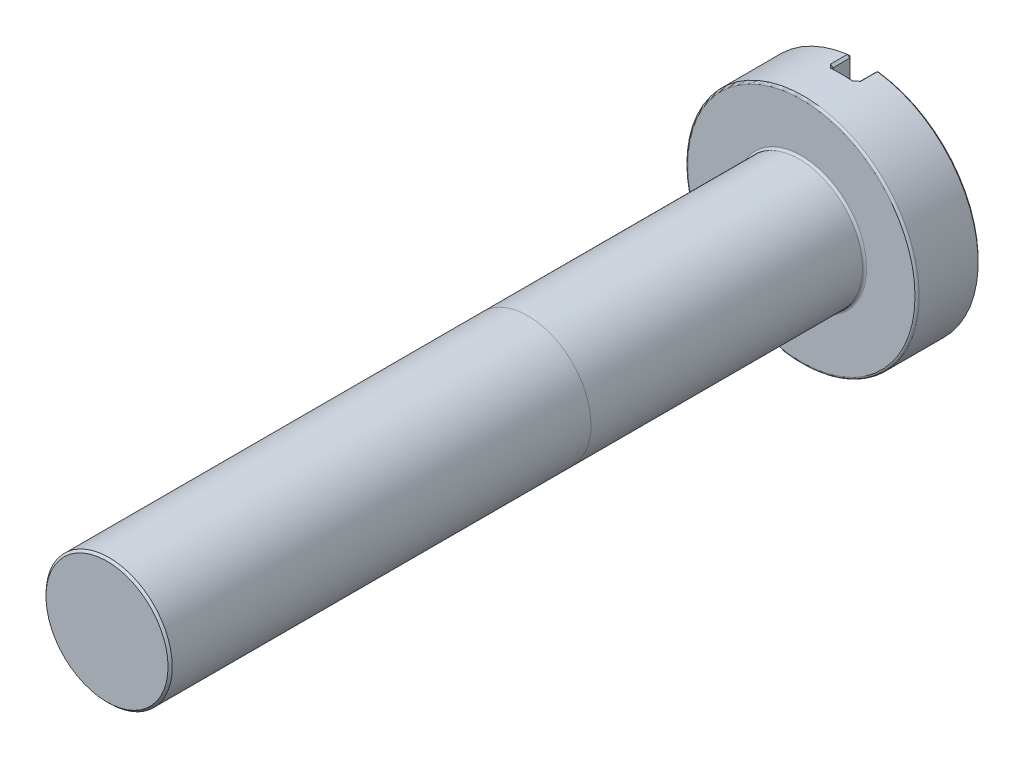
ISO-10303-21;
HEADER;
FILE_DESCRIPTION(('STEP AP214'),'2;1');
FILE_NAME('part.step','',(''),(''),'','','');
FILE_SCHEMA(('AUTOMOTIVE_DESIGN { 1 0 10303 214 1 1 1 1 }'));
ENDSEC;
DATA;
#1=APPLICATION_CONTEXT('core data for automotive mechanical design processes');
#2=APPLICATION_PROTOCOL_DEFINITION('international standard','automotive_design',2000,#1);
#3=PRODUCT_CONTEXT('',#1,'mechanical');
#4=PRODUCT('Part','Part','',(#3));
#5=PRODUCT_RELATED_PRODUCT_CATEGORY('part','',(#4));
#6=PRODUCT_DEFINITION_FORMATION('','',#4);
#7=PRODUCT_DEFINITION_CONTEXT('part definition',#1,'design');
#8=PRODUCT_DEFINITION('design','',#6,#7);
#9=PRODUCT_DEFINITION_SHAPE('','',#8);
#10=(LENGTH_UNIT() NAMED_UNIT(*) SI_UNIT(.MILLI.,.METRE.));
#11=(NAMED_UNIT(*) PLANE_ANGLE_UNIT() SI_UNIT($,.RADIAN.));
#12=(NAMED_UNIT(*) SI_UNIT($,.STERADIAN.) SOLID_ANGLE_UNIT());
#13=UNCERTAINTY_MEASURE_WITH_UNIT(LENGTH_MEASURE(1.E-05),#10,'distance_accuracy_value','');
#14=(GEOMETRIC_REPRESENTATION_CONTEXT(3) GLOBAL_UNCERTAINTY_ASSIGNED_CONTEXT((#13)) GLOBAL_UNIT_ASSIGNED_CONTEXT((#10,
#11,#12)) REPRESENTATION_CONTEXT('',''));
#15=CARTESIAN_POINT('',(0.,0.,0.));
#16=DIRECTION('',(0.,0.,1.));
#17=DIRECTION('',(1.,0.,0.));
#18=AXIS2_PLACEMENT_3D('',#15,#16,#17);
#19=CARTESIAN_POINT('',(0.,0.,165.));
#20=DIRECTION('',(0.,0.,-1.));
#21=DIRECTION('',(-1.,0.,0.));
#22=AXIS2_PLACEMENT_3D('',#19,#20,#21);
#23=CYLINDRICAL_SURFACE('',#22,15.);
#24=CARTESIAN_POINT('',(0.,0.,164.5));
#25=DIRECTION('',(0.,0.,1.));
#26=DIRECTION('',(1.,0.,0.));
#27=AXIS2_PLACEMENT_3D('',#24,#25,#26);
#28=CIRCLE('',#27,15.);
#29=CARTESIAN_POINT('',(15.,0.,164.5));
#30=VERTEX_POINT('',#29);
#31=EDGE_CURVE('E59',#30,#30,#28,.F.);
#32=ORIENTED_EDGE('',*,*,#31,.T.);
#33=EDGE_LOOP('',(#32));
#34=FACE_BOUND('',#33,.T.);
#35=CARTESIAN_POINT('',(0.,0.,65.));
#36=DIRECTION('',(0.,0.,-1.));
#37=DIRECTION('',(-1.,0.,0.));
#38=AXIS2_PLACEMENT_3D('',#35,#36,#37);
#39=CIRCLE('',#38,15.);
#40=CARTESIAN_POINT('',(-15.,0.,65.));
#41=VERTEX_POINT('',#40);
#42=EDGE_CURVE('E11',#41,#41,#39,.T.);
#43=ORIENTED_EDGE('',*,*,#42,.F.);
#44=EDGE_LOOP('',(#43));
#45=FACE_BOUND('',#44,.T.);
#46=ADVANCED_FACE('F49',(#34,#45),#23,.T.);
#47=CARTESIAN_POINT('',(0.,0.,-15.));
#48=DIRECTION('',(0.,0.,1.));
#49=DIRECTION('',(1.,0.,0.));
#50=AXIS2_PLACEMENT_3D('',#47,#48,#49);
#51=CYLINDRICAL_SURFACE('',#50,27.5);
#52=CARTESIAN_POINT('',(0.,0.,-0.5));
#53=DIRECTION('',(0.,0.,-1.));
#54=DIRECTION('',(-1.,0.,0.));
#55=AXIS2_PLACEMENT_3D('',#52,#53,#54);
#56=CIRCLE('',#55,27.5);
#57=CARTESIAN_POINT('',(-27.5,0.,-0.5));
#58=VERTEX_POINT('',#57);
#59=EDGE_CURVE('E215',#58,#58,#56,.T.);
#60=ORIENTED_EDGE('',*,*,#59,.T.);
#61=EDGE_LOOP('',(#60));
#62=FACE_BOUND('',#61,.T.);
#63=CARTESIAN_POINT('',(3.56481481481482,-27.2679683023154,-10.5));
#64=CARTESIAN_POINT('',(3.47664395842464,-27.2794946380013,-10.4117807206455));
#65=CARTESIAN_POINT('',(3.3882512364023,-27.290615860206,-10.3237298581949));
#66=CARTESIAN_POINT('',(3.21099028338334,-27.3120398569253,-10.1480079977808));
#67=CARTESIAN_POINT('',(3.12212205212934,-27.3223426309969,-10.060337000023));
#68=CARTESIAN_POINT('',(2.87162841255623,-27.3501387422923,-9.81451563587228));
#69=CARTESIAN_POINT('',(2.70942516357561,-27.3666902458214,-9.65684718088892));
#70=CARTESIAN_POINT('',(2.54629629629627,-27.3818621567538,-9.5));
#71=B_SPLINE_CURVE_WITH_KNOTS('',3,(#63,#64,#65,#66,#67,#68,#69,#70),.UNSPECIFIED.,.F.,.F.,(4,2,
2,4),(0.,0.375773794297742,0.75154779202129,1.431957218964),.UNSPECIFIED.);
#72=CARTESIAN_POINT('',(3.56481481481482,-27.2679683023154,-10.5));
#73=VERTEX_POINT('',#72);
#74=CARTESIAN_POINT('',(2.54629629629627,-27.3818621567538,-9.5));
#75=VERTEX_POINT('',#74);
#76=EDGE_CURVE('E345',#73,#75,#71,.T.);
#77=ORIENTED_EDGE('',*,*,#76,.F.);
#78=DIRECTION('',(0.,0.,1.));
#79=VECTOR('',#78,1.);
#80=CARTESIAN_POINT('',(3.56481481481482,-27.2679683023154,-15.));
#81=LINE('',#80,#79);
#82=CARTESIAN_POINT('',(3.56481481481482,-27.2679683023154,-14.5));
#83=VERTEX_POINT('',#82);
#84=EDGE_CURVE('E355',#73,#83,#81,.F.);
#85=ORIENTED_EDGE('',*,*,#84,.T.);
#86=CARTESIAN_POINT('',(0.,0.,-14.5));
#87=DIRECTION('',(0.,0.,-1.));
#88=DIRECTION('',(-1.,0.,0.));
#89=AXIS2_PLACEMENT_3D('',#86,#87,#88);
#90=CIRCLE('',#89,27.5);
#91=CARTESIAN_POINT('',(3.56481481481482,27.2679683023154,-14.5));
#92=VERTEX_POINT('',#91);
#93=EDGE_CURVE('E991',#83,#92,#90,.F.);
#94=ORIENTED_EDGE('',*,*,#93,.T.);
#95=DIRECTION('',(0.,0.,1.));
#96=VECTOR('',#95,1.);
#97=CARTESIAN_POINT('',(3.56481481481482,27.2679683023154,-15.));
#98=LINE('',#97,#96);
#99=CARTESIAN_POINT('',(3.56481481481482,27.2679683023154,-10.5));
#100=VERTEX_POINT('',#99);
#101=EDGE_CURVE('E315',#92,#100,#98,.T.);
#102=ORIENTED_EDGE('',*,*,#101,.T.);
#103=CARTESIAN_POINT('',(2.54629629629627,27.3818621567538,-9.5));
#104=CARTESIAN_POINT('',(2.63638943794519,27.3734837041016,-9.58661912495162));
#105=CARTESIAN_POINT('',(2.72619899169559,27.3646840241962,-9.67349125297718));
#106=CARTESIAN_POINT('',(2.90528422567069,27.346250867949,-9.84769605017457));
#107=CARTESIAN_POINT('',(2.9945599063411,27.3366173923035,-9.93502871896181));
#108=CARTESIAN_POINT('',(3.24478250116621,27.3083811004551,-10.1810769091684));
#109=CARTESIAN_POINT('',(3.40515929031504,27.2888381956303,-10.34026548804));
#110=CARTESIAN_POINT('',(3.56481481481482,27.2679683023154,-10.5));
#111=B_SPLINE_CURVE_WITH_KNOTS('',3,(#103,#104,#105,#106,#107,#108,#109,#110),.UNSPECIFIED.,.F.,
.F.,(4,2,2,4),(0.,0.375774596881589,0.751548880003349,1.43195791124041),.UNSPECIFIED.);
#112=CARTESIAN_POINT('',(2.54629629629627,27.3818621567538,-9.5));
#113=VERTEX_POINT('',#112);
#114=EDGE_CURVE('E307',#113,#100,#111,.T.);
#115=ORIENTED_EDGE('',*,*,#114,.F.);
#116=CARTESIAN_POINT('',(0.,0.,-9.5));
#117=DIRECTION('',(0.,0.,1.));
#118=DIRECTION('',(1.,0.,0.));
#119=AXIS2_PLACEMENT_3D('',#116,#117,#118);
#120=CIRCLE('',#119,27.5);
#121=CARTESIAN_POINT('',(-2.54629629629627,27.3818621567538,-9.5));
#122=VERTEX_POINT('',#121);
#123=EDGE_CURVE('E292',#113,#122,#120,.T.);
#124=ORIENTED_EDGE('',*,*,#123,.T.);
#125=CARTESIAN_POINT('',(-3.56481481481482,27.2679683023154,-10.5));
#126=CARTESIAN_POINT('',(-3.47664395842464,27.2794946380013,-10.4117807206455));
#127=CARTESIAN_POINT('',(-3.3882512364023,27.290615860206,-10.3237298581949));
#128=CARTESIAN_POINT('',(-3.21099028338334,27.3120398569253,-10.1480079977808));
#129=CARTESIAN_POINT('',(-3.12212205212934,27.3223426309969,-10.060337000023));
#130=CARTESIAN_POINT('',(-2.87162841255622,27.3501387422923,-9.81451563587229));
#131=CARTESIAN_POINT('',(-2.7094251635756,27.3666902458214,-9.65684718088892));
#132=CARTESIAN_POINT('',(-2.54629629629627,27.3818621567538,-9.5));
#133=B_SPLINE_CURVE_WITH_KNOTS('',3,(#125,#126,#127,#128,#129,#130,#131,#132),.UNSPECIFIED.,.F.,
.F.,(4,2,2,4),(0.,0.375773794297743,0.751547792021289,1.431957218964),.UNSPECIFIED.);
#134=CARTESIAN_POINT('',(-3.56481481481482,27.2679683023154,-10.5));
#135=VERTEX_POINT('',#134);
#136=EDGE_CURVE('E160',#135,#122,#133,.T.);
#137=ORIENTED_EDGE('',*,*,#136,.F.);
#138=DIRECTION('',(0.,0.,1.));
#139=VECTOR('',#138,1.);
#140=CARTESIAN_POINT('',(-3.56481481481482,27.2679683023154,-15.));
#141=LINE('',#140,#139);
#142=CARTESIAN_POINT('',(-3.56481481481482,27.2679683023154,-14.5));
#143=VERTEX_POINT('',#142);
#144=EDGE_CURVE('E154',#135,#143,#141,.F.);
#145=ORIENTED_EDGE('',*,*,#144,.T.);
#146=CARTESIAN_POINT('',(0.,0.,-14.5));
#147=DIRECTION('',(0.,0.,-1.));
#148=DIRECTION('',(-1.,0.,0.));
#149=AXIS2_PLACEMENT_3D('',#146,#147,#148);
#150=CIRCLE('',#149,27.5);
#151=CARTESIAN_POINT('',(-3.56481481481485,-27.2679683023154,-14.5));
#152=VERTEX_POINT('',#151);
#153=EDGE_CURVE('E157',#143,#152,#150,.F.);
#154=ORIENTED_EDGE('',*,*,#153,.T.);
#155=DIRECTION('',(0.,0.,1.));
#156=VECTOR('',#155,1.);
#157=CARTESIAN_POINT('',(-3.56481481481485,-27.2679683023154,-15.));
#158=LINE('',#157,#156);
#159=CARTESIAN_POINT('',(-3.56481481481485,-27.2679683023154,-10.5));
#160=VERTEX_POINT('',#159);
#161=EDGE_CURVE('E166',#152,#160,#158,.T.);
#162=ORIENTED_EDGE('',*,*,#161,.T.);
#163=CARTESIAN_POINT('',(-2.54629629629627,-27.3818621567538,-9.5));
#164=CARTESIAN_POINT('',(-2.63638943794519,-27.3734837041016,-9.58661912495162));
#165=CARTESIAN_POINT('',(-2.72619899169559,-27.3646840241962,-9.67349125297718));
#166=CARTESIAN_POINT('',(-2.9052842256707,-27.346250867949,-9.84769605017457));
#167=CARTESIAN_POINT('',(-2.9945599063411,-27.3366173923035,-9.9350287189618));
#168=CARTESIAN_POINT('',(-3.24478250116623,-27.3083811004551,-10.1810769091684));
#169=CARTESIAN_POINT('',(-3.40515929031506,-27.2888381956303,-10.34026548804));
#170=CARTESIAN_POINT('',(-3.56481481481485,-27.2679683023154,-10.5));
#171=B_SPLINE_CURVE_WITH_KNOTS('',3,(#163,#164,#165,#166,#167,#168,#169,#170),.UNSPECIFIED.,.F.,
.F.,(4,2,2,4),(0.,0.375774596881591,0.751548880003354,1.43195791124043),.UNSPECIFIED.);
#172=CARTESIAN_POINT('',(-2.54629629629627,-27.3818621567538,-9.5));
#173=VERTEX_POINT('',#172);
#174=EDGE_CURVE('E301',#173,#160,#171,.T.);
#175=ORIENTED_EDGE('',*,*,#174,.F.);
#176=CARTESIAN_POINT('',(0.,0.,-9.5));
#177=DIRECTION('',(0.,0.,1.));
#178=DIRECTION('',(1.,0.,0.));
#179=AXIS2_PLACEMENT_3D('',#176,#177,#178);
#180=CIRCLE('',#179,27.5);
#181=EDGE_CURVE('E544',#173,#75,#180,.T.);
#182=ORIENTED_EDGE('',*,*,#181,.T.);
#183=EDGE_LOOP('',(#77,#85,#94,#102,#115,#124,#137,#145,#154,#162,#175,#182));
#184=FACE_BOUND('',#183,.T.);
#185=ADVANCED_FACE('F156',(#62,#184),#51,.T.);
#186=CARTESIAN_POINT('',(0.,0.,-15.));
#187=DIRECTION('',(0.,0.,-1.));
#188=DIRECTION('',(-1.,0.,0.));
#189=AXIS2_PLACEMENT_3D('',#186,#187,#188);
#190=PLANE('',#189);
#191=DIRECTION('',(0.,-1.,0.));
#192=VECTOR('',#191,1.);
#193=CARTESIAN_POINT('',(-3.50000000000003,-27.3358738656733,-15.));
#194=LINE('',#193,#192);
#195=CARTESIAN_POINT('',(-3.50000000000003,26.7721870604551,-15.));
#196=VERTEX_POINT('',#195);
#197=CARTESIAN_POINT('',(-3.50000000000003,-26.7721870604551,-15.));
#198=VERTEX_POINT('',#197);
#199=EDGE_CURVE('E65',#196,#198,#194,.T.);
#200=ORIENTED_EDGE('',*,*,#199,.T.);
#201=CARTESIAN_POINT('',(0.,0.,-15.));
#202=DIRECTION('',(0.,0.,-1.));
#203=DIRECTION('',(-1.,0.,0.));
#204=AXIS2_PLACEMENT_3D('',#201,#202,#203);
#205=CIRCLE('',#204,27.);
#206=EDGE_CURVE('E220',#198,#196,#205,.T.);
#207=ORIENTED_EDGE('',*,*,#206,.T.);
#208=EDGE_LOOP('',(#200,#207));
#209=FACE_BOUND('',#208,.T.);
#210=ADVANCED_FACE('F258',(#209),#190,.T.);
#211=ORIENTED_EDGE('',*,*,#42,.T.);
#212=EDGE_LOOP('',(#211));
#213=FACE_BOUND('',#212,.T.);
#214=CARTESIAN_POINT('',(0.,0.,0.5));
#215=DIRECTION('',(0.,0.,-1.));
#216=DIRECTION('',(-1.,0.,0.));
#217=AXIS2_PLACEMENT_3D('',#214,#215,#216);
#218=CIRCLE('',#217,15.);
#219=CARTESIAN_POINT('',(-15.,0.,0.5));
#220=VERTEX_POINT('',#219);
#221=EDGE_CURVE('E228',#220,#220,#218,.F.);
#222=ORIENTED_EDGE('',*,*,#221,.T.);
#223=EDGE_LOOP('',(#222));
#224=FACE_BOUND('',#223,.T.);
#225=ADVANCED_FACE('F249',(#213,#224),#23,.T.);
#226=CARTESIAN_POINT('',(0.,0.,165.));
#227=DIRECTION('',(0.,0.,1.));
#228=DIRECTION('',(1.,0.,0.));
#229=AXIS2_PLACEMENT_3D('',#226,#227,#228);
#230=PLANE('',#229);
#231=CARTESIAN_POINT('',(0.,0.,165.));
#232=DIRECTION('',(0.,0.,1.));
#233=DIRECTION('',(1.,0.,0.));
#234=AXIS2_PLACEMENT_3D('',#231,#232,#233);
#235=CIRCLE('',#234,14.5);
#236=CARTESIAN_POINT('',(14.5,0.,165.));
#237=VERTEX_POINT('',#236);
#238=EDGE_CURVE('E232',#237,#237,#235,.T.);
#239=ORIENTED_EDGE('',*,*,#238,.T.);
#240=EDGE_LOOP('',(#239));
#241=FACE_BOUND('',#240,.T.);
#242=ADVANCED_FACE('F246',(#241),#230,.T.);
#243=DIRECTION('',(0.,1.,0.));
#244=VECTOR('',#243,1.);
#245=CARTESIAN_POINT('',(3.50000000000003,27.3358738656733,-15.));
#246=LINE('',#245,#244);
#247=CARTESIAN_POINT('',(3.50000000000003,-26.7721870604551,-15.));
#248=VERTEX_POINT('',#247);
#249=CARTESIAN_POINT('',(3.50000000000003,26.7721870604551,-15.));
#250=VERTEX_POINT('',#249);
#251=EDGE_CURVE('E393',#248,#250,#246,.T.);
#252=ORIENTED_EDGE('',*,*,#251,.T.);
#253=CARTESIAN_POINT('',(0.,0.,-15.));
#254=DIRECTION('',(0.,0.,-1.));
#255=DIRECTION('',(-1.,0.,0.));
#256=AXIS2_PLACEMENT_3D('',#253,#254,#255);
#257=CIRCLE('',#256,27.);
#258=EDGE_CURVE('E396',#250,#248,#257,.T.);
#259=ORIENTED_EDGE('',*,*,#258,.T.);
#260=EDGE_LOOP('',(#252,#259));
#261=FACE_BOUND('',#260,.T.);
#262=ADVANCED_FACE('F248',(#261),#190,.T.);
#263=CARTESIAN_POINT('',(0.,0.,0.));
#264=DIRECTION('',(0.,0.,-1.));
#265=DIRECTION('',(-1.,0.,0.));
#266=AXIS2_PLACEMENT_3D('',#263,#264,#265);
#267=PLANE('',#266);
#268=CARTESIAN_POINT('',(0.,0.,0.));
#269=DIRECTION('',(0.,0.,-1.));
#270=DIRECTION('',(-1.,0.,0.));
#271=AXIS2_PLACEMENT_3D('',#268,#269,#270);
#272=CIRCLE('',#271,27.);
#273=CARTESIAN_POINT('',(-27.,0.,0.));
#274=VERTEX_POINT('',#273);
#275=EDGE_CURVE('E224',#274,#274,#272,.F.);
#276=ORIENTED_EDGE('',*,*,#275,.T.);
#277=EDGE_LOOP('',(#276));
#278=FACE_BOUND('',#277,.T.);
#279=CARTESIAN_POINT('',(0.,0.,0.));
#280=DIRECTION('',(0.,0.,-1.));
#281=DIRECTION('',(-1.,0.,0.));
#282=AXIS2_PLACEMENT_3D('',#279,#280,#281);
#283=CIRCLE('',#282,15.5);
#284=CARTESIAN_POINT('',(-15.5,0.,0.));
#285=VERTEX_POINT('',#284);
#286=EDGE_CURVE('E219',#285,#285,#283,.T.);
#287=ORIENTED_EDGE('',*,*,#286,.T.);
#288=EDGE_LOOP('',(#287));
#289=FACE_BOUND('',#288,.T.);
#290=ADVANCED_FACE('F255',(#278,#289),#267,.F.);
#291=CARTESIAN_POINT('',(0.,0.,-10.));
#292=DIRECTION('',(0.,0.,1.));
#293=DIRECTION('',(1.,0.,0.));
#294=AXIS2_PLACEMENT_3D('',#291,#292,#293);
#295=PLANE('',#294);
#296=DIRECTION('',(0.,1.,0.));
#297=VECTOR('',#296,1.);
#298=CARTESIAN_POINT('',(-2.49999999999997,27.3358738656733,-10.));
#299=LINE('',#298,#297);
#300=CARTESIAN_POINT('',(-2.49999999999997,-26.8840101175401,-10.));
#301=VERTEX_POINT('',#300);
#302=CARTESIAN_POINT('',(-2.49999999999997,26.8840101175401,-10.));
#303=VERTEX_POINT('',#302);
#304=EDGE_CURVE('E386',#301,#303,#299,.T.);
#305=ORIENTED_EDGE('',*,*,#304,.T.);
#306=CARTESIAN_POINT('',(0.,0.,-10.));
#307=DIRECTION('',(0.,0.,1.));
#308=DIRECTION('',(1.,0.,0.));
#309=AXIS2_PLACEMENT_3D('',#306,#307,#308);
#310=CIRCLE('',#309,27.);
#311=CARTESIAN_POINT('',(2.49999999999997,26.8840101175401,-10.));
#312=VERTEX_POINT('',#311);
#313=EDGE_CURVE('E389',#303,#312,#310,.F.);
#314=ORIENTED_EDGE('',*,*,#313,.T.);
#315=DIRECTION('',(0.,-1.,0.));
#316=VECTOR('',#315,1.);
#317=CARTESIAN_POINT('',(2.49999999999997,-27.3358738656733,-10.));
#318=LINE('',#317,#316);
#319=CARTESIAN_POINT('',(2.49999999999997,-26.8840101175401,-10.));
#320=VERTEX_POINT('',#319);
#321=EDGE_CURVE('E380',#312,#320,#318,.T.);
#322=ORIENTED_EDGE('',*,*,#321,.T.);
#323=CARTESIAN_POINT('',(0.,0.,-10.));
#324=DIRECTION('',(0.,0.,1.));
#325=DIRECTION('',(1.,0.,0.));
#326=AXIS2_PLACEMENT_3D('',#323,#324,#325);
#327=CIRCLE('',#326,27.);
#328=EDGE_CURVE('E383',#320,#301,#327,.F.);
#329=ORIENTED_EDGE('',*,*,#328,.T.);
#330=EDGE_LOOP('',(#305,#314,#322,#329));
#331=FACE_BOUND('',#330,.T.);
#332=ADVANCED_FACE('F555',(#331),#295,.F.);
#333=CARTESIAN_POINT('',(-3.,-35.,-10.));
#334=DIRECTION('',(-1.,0.,0.));
#335=DIRECTION('',(0.,0.,1.));
#336=AXIS2_PLACEMENT_3D('',#333,#334,#335);
#337=PLANE('',#336);
#338=DIRECTION('',(0.,0.,1.));
#339=VECTOR('',#338,1.);
#340=CARTESIAN_POINT('',(-3.,26.7721870604551,-10.));
#341=LINE('',#340,#339);
#342=CARTESIAN_POINT('',(-3.,26.7721870604551,-14.5));
#343=VERTEX_POINT('',#342);
#344=CARTESIAN_POINT('',(-3.,26.7721870604551,-10.5));
#345=VERTEX_POINT('',#344);
#346=EDGE_CURVE('E185',#343,#345,#341,.T.);
#347=ORIENTED_EDGE('',*,*,#346,.T.);
#348=DIRECTION('',(0.,-1.,0.));
#349=VECTOR('',#348,1.);
#350=CARTESIAN_POINT('',(-3.,-27.3358738656733,-10.5));
#351=LINE('',#350,#349);
#352=CARTESIAN_POINT('',(-3.,-26.7721870604551,-10.5));
#353=VERTEX_POINT('',#352);
#354=EDGE_CURVE('E377',#345,#353,#351,.T.);
#355=ORIENTED_EDGE('',*,*,#354,.T.);
#356=DIRECTION('',(0.,0.,-1.));
#357=VECTOR('',#356,1.);
#358=CARTESIAN_POINT('',(-3.,-26.7721870604551,-10.));
#359=LINE('',#358,#357);
#360=CARTESIAN_POINT('',(-3.,-26.7721870604551,-14.5));
#361=VERTEX_POINT('',#360);
#362=EDGE_CURVE('E372',#353,#361,#359,.T.);
#363=ORIENTED_EDGE('',*,*,#362,.T.);
#364=DIRECTION('',(0.,1.,0.));
#365=VECTOR('',#364,1.);
#366=CARTESIAN_POINT('',(-3.,27.3358738656733,-14.5));
#367=LINE('',#366,#365);
#368=EDGE_CURVE('E369',#361,#343,#367,.T.);
#369=ORIENTED_EDGE('',*,*,#368,.T.);
#370=EDGE_LOOP('',(#347,#355,#363,#369));
#371=FACE_BOUND('',#370,.T.);
#372=ADVANCED_FACE('F585',(#371),#337,.F.);
#373=CARTESIAN_POINT('',(3.,-35.,-10.));
#374=DIRECTION('',(1.,0.,0.));
#375=DIRECTION('',(0.,0.,-1.));
#376=AXIS2_PLACEMENT_3D('',#373,#374,#375);
#377=PLANE('',#376);
#378=DIRECTION('',(0.,0.,1.));
#379=VECTOR('',#378,1.);
#380=CARTESIAN_POINT('',(3.,-26.7721870604551,-10.));
#381=LINE('',#380,#379);
#382=CARTESIAN_POINT('',(3.,-26.7721870604551,-14.5));
#383=VERTEX_POINT('',#382);
#384=CARTESIAN_POINT('',(3.,-26.7721870604551,-10.5));
#385=VERTEX_POINT('',#384);
#386=EDGE_CURVE('E359',#383,#385,#381,.T.);
#387=ORIENTED_EDGE('',*,*,#386,.T.);
#388=DIRECTION('',(0.,1.,0.));
#389=VECTOR('',#388,1.);
#390=CARTESIAN_POINT('',(3.,27.3358738656733,-10.5));
#391=LINE('',#390,#389);
#392=CARTESIAN_POINT('',(3.,26.7721870604551,-10.5));
#393=VERTEX_POINT('',#392);
#394=EDGE_CURVE('E366',#385,#393,#391,.T.);
#395=ORIENTED_EDGE('',*,*,#394,.T.);
#396=DIRECTION('',(0.,0.,-1.));
#397=VECTOR('',#396,1.);
#398=CARTESIAN_POINT('',(3.,26.7721870604551,-10.));
#399=LINE('',#398,#397);
#400=CARTESIAN_POINT('',(3.,26.7721870604551,-14.5));
#401=VERTEX_POINT('',#400);
#402=EDGE_CURVE('E362',#393,#401,#399,.T.);
#403=ORIENTED_EDGE('',*,*,#402,.T.);
#404=DIRECTION('',(0.,-1.,0.));
#405=VECTOR('',#404,1.);
#406=CARTESIAN_POINT('',(3.,-27.3358738656733,-14.5));
#407=LINE('',#406,#405);
#408=EDGE_CURVE('E354',#401,#383,#407,.T.);
#409=ORIENTED_EDGE('',*,*,#408,.T.);
#410=EDGE_LOOP('',(#387,#395,#403,#409));
#411=FACE_BOUND('',#410,.T.);
#412=ADVANCED_FACE('F596',(#411),#377,.F.);
#413=CARTESIAN_POINT('',(-3.,-26.7721870604551,-14.5));
#414=DIRECTION('',(0.550659428732122,-0.62733435032428,-0.550659428732157));
#415=DIRECTION('',(0.,0.659685671502109,-0.751541625470481));
#416=AXIS2_PLACEMENT_3D('',#413,#414,#415);
#417=PLANE('',#416);
#418=DIRECTION('',(0.7515416254705,0.659685671502087,0.));
#419=VECTOR('',#418,1.);
#420=CARTESIAN_POINT('',(-3.,-26.7721870604551,-14.5));
#421=LINE('',#420,#419);
#422=EDGE_CURVE('E181',#152,#361,#421,.T.);
#423=ORIENTED_EDGE('',*,*,#422,.F.);
#424=DIRECTION('',(0.0916619901538126,0.701140556208983,-0.707106781186548));
#425=VECTOR('',#424,1.);
#426=CARTESIAN_POINT('',(0.,0.,-42.));
#427=LINE('',#426,#425);
#428=EDGE_CURVE('E173',#198,#152,#427,.F.);
#429=ORIENTED_EDGE('',*,*,#428,.F.);
#430=DIRECTION('',(0.707106781186547,0.,0.707106781186547));
#431=VECTOR('',#430,1.);
#432=CARTESIAN_POINT('',(-3.,-26.7721870604551,-14.5));
#433=LINE('',#432,#431);
#434=EDGE_CURVE('E210',#361,#198,#433,.F.);
#435=ORIENTED_EDGE('',*,*,#434,.F.);
#436=EDGE_LOOP('',(#423,#429,#435));
#437=FACE_BOUND('',#436,.T.);
#438=ADVANCED_FACE('F599',(#437),#417,.T.);
#439=CARTESIAN_POINT('',(0.,0.,-15.));
#440=DIRECTION('',(0.,0.,1.));
#441=DIRECTION('',(1.,0.,0.));
#442=AXIS2_PLACEMENT_3D('',#439,#440,#441);
#443=CONICAL_SURFACE('',#442,27.,0.785398163397448);
#444=ORIENTED_EDGE('',*,*,#428,.T.);
#445=ORIENTED_EDGE('',*,*,#153,.F.);
#446=DIRECTION('',(-0.0916619901537748,0.701140556208988,0.707106781186547));
#447=VECTOR('',#446,1.);
#448=CARTESIAN_POINT('',(-4.98636239587195E-13,-5.68067348142539E-13,-41.9999999999995));
#449=LINE('',#448,#447);
#450=EDGE_CURVE('E171',#196,#143,#449,.T.);
#451=ORIENTED_EDGE('',*,*,#450,.F.);
#452=ORIENTED_EDGE('',*,*,#206,.F.);
#453=EDGE_LOOP('',(#444,#445,#451,#452));
#454=FACE_BOUND('',#453,.T.);
#455=ADVANCED_FACE('F169',(#454),#443,.T.);
#456=CARTESIAN_POINT('',(-3.,-35.,-14.5));
#457=DIRECTION('',(0.707106781186548,0.,-0.707106781186548));
#458=DIRECTION('',(0.,-1.,0.));
#459=AXIS2_PLACEMENT_3D('',#456,#457,#458);
#460=PLANE('',#459);
#461=ORIENTED_EDGE('',*,*,#434,.T.);
#462=ORIENTED_EDGE('',*,*,#199,.F.);
#463=DIRECTION('',(-0.707106781186547,0.,-0.707106781186547));
#464=VECTOR('',#463,1.);
#465=CARTESIAN_POINT('',(-3.28240740740741,26.7721870604551,-14.7824074074074));
#466=LINE('',#465,#464);
#467=EDGE_CURVE('E73',#343,#196,#466,.T.);
#468=ORIENTED_EDGE('',*,*,#467,.F.);
#469=ORIENTED_EDGE('',*,*,#368,.F.);
#470=EDGE_LOOP('',(#461,#462,#468,#469));
#471=FACE_BOUND('',#470,.T.);
#472=ADVANCED_FACE('F588',(#471),#460,.T.);
#473=CARTESIAN_POINT('',(-3.56481481481484,-27.2679683023154,-15.));
#474=DIRECTION('',(-0.659685671502087,0.7515416254705,0.));
#475=DIRECTION('',(0.,0.,1.));
#476=AXIS2_PLACEMENT_3D('',#473,#474,#475);
#477=PLANE('',#476);
#478=ORIENTED_EDGE('',*,*,#422,.T.);
#479=ORIENTED_EDGE('',*,*,#362,.F.);
#480=DIRECTION('',(0.751541625470499,0.659685671502087,0.));
#481=VECTOR('',#480,1.);
#482=CARTESIAN_POINT('',(-3.56481481481485,-27.2679683023154,-10.5));
#483=LINE('',#482,#481);
#484=EDGE_CURVE('E187',#160,#353,#483,.T.);
#485=ORIENTED_EDGE('',*,*,#484,.F.);
#486=ORIENTED_EDGE('',*,*,#161,.F.);
#487=EDGE_LOOP('',(#478,#479,#485,#486));
#488=FACE_BOUND('',#487,.T.);
#489=ADVANCED_FACE('F639',(#488),#477,.F.);
#490=CARTESIAN_POINT('',(-3.56481481481482,27.2679683023154,-14.5));
#491=DIRECTION('',(0.550659428732155,0.627334350324251,-0.550659428732158));
#492=DIRECTION('',(0.,0.659685671502127,0.751541625470465));
#493=AXIS2_PLACEMENT_3D('',#490,#491,#492);
#494=PLANE('',#493);
#495=ORIENTED_EDGE('',*,*,#467,.T.);
#496=ORIENTED_EDGE('',*,*,#450,.T.);
#497=DIRECTION('',(0.751541625470467,-0.659685671502124,0.));
#498=VECTOR('',#497,1.);
#499=CARTESIAN_POINT('',(-3.56481481481482,27.2679683023154,-14.5));
#500=LINE('',#499,#498);
#501=EDGE_CURVE('E178',#343,#143,#500,.F.);
#502=ORIENTED_EDGE('',*,*,#501,.F.);
#503=EDGE_LOOP('',(#495,#496,#502));
#504=FACE_BOUND('',#503,.T.);
#505=ADVANCED_FACE('F177',(#504),#494,.T.);
#506=CARTESIAN_POINT('',(-2.49999999999997,-26.8840101175401,-10.));
#507=CARTESIAN_POINT('',(-3.,-26.7721870604551,-10.5));
#508=CARTESIAN_POINT('',(-2.54629629629627,-27.3818621567538,-9.5));
#509=CARTESIAN_POINT('',(-3.56481481481485,-27.2679683023154,-10.5));
#510=CARTESIAN_POINT('',(-2.5470049395795,-27.3894826260323,-9.49234665254114));
#511=CARTESIAN_POINT('',(-3.57346026287023,-27.2755570745305,-10.5));
#512=B_SPLINE_SURFACE_WITH_KNOTS('',1,1,((#506,#507),(#508,#509),(#510,#511)),.UNSPECIFIED.,.F.,
.F.,.F.,(2,1,2),(2,2),(0.,1.,1.01530669491772),(0.,1.),.UNSPECIFIED.);
#513=CARTESIAN_POINT('',(-3.,-26.7721870604551,-10.5));
#514=CARTESIAN_POINT('',(-2.95625856762104,-26.7819696618349,-10.456258567621));
#515=CARTESIAN_POINT('',(-2.91251713524209,-26.7917522632147,-10.4125171352421));
#516=CARTESIAN_POINT('',(-2.84690498667366,-26.8064261652843,-10.3469049866737));
#517=CARTESIAN_POINT('',(-2.82503427048418,-26.8113174659742,-10.3250342704842));
#518=CARTESIAN_POINT('',(-2.78129283810522,-26.821100067354,-10.2812928381052));
#519=CARTESIAN_POINT('',(-2.75942212191575,-26.8259913680439,-10.2594221219158));
#520=CARTESIAN_POINT('',(-2.71568068953679,-26.8357739694237,-10.2156806895368));
#521=CARTESIAN_POINT('',(-2.69380997334731,-26.8406652701136,-10.1938099733473));
#522=CARTESIAN_POINT('',(-2.65006854096836,-26.8504478714934,-10.1500685409684));
#523=CARTESIAN_POINT('',(-2.62819782477888,-26.8553391721833,-10.1281978247789));
#524=CARTESIAN_POINT('',(-2.57088473905959,-26.8681570210955,-10.0708847390596));
#525=CARTESIAN_POINT('',(-2.53544236952978,-26.8760835693178,-10.0354423695298));
#526=CARTESIAN_POINT('',(-2.49999999999997,-26.8840101175401,-10.));
#527=B_SPLINE_CURVE_WITH_KNOTS('',3,(#513,#514,#515,#516,#517,#518,#519,#520,#521,#522,#523,
#524,#525,#526),.UNSPECIFIED.,.F.,.F.,(4,2,2,2,2,2,4),(0.,0.187885406367626,0.28182810955144,
0.375770812735253,0.469713515919067,0.563656219102881,0.715894123523767),.UNSPECIFIED.);
#528=EDGE_CURVE('E188',#301,#353,#527,.F.);
#529=DIRECTION('',(-0.0654728501098674,-0.704069105911146,0.707106781186526));
#530=VECTOR('',#529,1.);
#531=CARTESIAN_POINT('',(-2.49999999999997,-26.8840101175401,-10.));
#532=LINE('',#531,#530);
#533=EDGE_CURVE('E195',#173,#301,#532,.F.);
#534=ORIENTED_EDGE('',*,*,#174,.T.);
#535=ORIENTED_EDGE('',*,*,#484,.T.);
#536=ORIENTED_EDGE('',*,*,#528,.F.);
#537=ORIENTED_EDGE('',*,*,#533,.F.);
#538=EDGE_LOOP('',(#534,#535,#536,#537));
#539=FACE_BOUND('',#538,.T.);
#540=ADVANCED_FACE('F548',(#539),#512,.T.);
#541=CARTESIAN_POINT('',(-3.56481481481482,27.2679683023154,-15.));
#542=DIRECTION('',(0.659685671502124,0.751541625470467,0.));
#543=DIRECTION('',(0.,0.,1.));
#544=AXIS2_PLACEMENT_3D('',#541,#542,#543);
#545=PLANE('',#544);
#546=ORIENTED_EDGE('',*,*,#501,.T.);
#547=ORIENTED_EDGE('',*,*,#144,.F.);
#548=DIRECTION('',(-0.751541625470467,0.659685671502124,0.));
#549=VECTOR('',#548,1.);
#550=CARTESIAN_POINT('',(-3.,26.7721870604551,-10.5));
#551=LINE('',#550,#549);
#552=EDGE_CURVE('E526',#345,#135,#551,.T.);
#553=ORIENTED_EDGE('',*,*,#552,.F.);
#554=ORIENTED_EDGE('',*,*,#346,.F.);
#555=EDGE_LOOP('',(#546,#547,#553,#554));
#556=FACE_BOUND('',#555,.T.);
#557=ADVANCED_FACE('F183',(#556),#545,.T.);
#558=CARTESIAN_POINT('',(-2.49999999999997,0.,-10.));
#559=DIRECTION('',(0.707106781186528,0.,-0.707106781186567));
#560=DIRECTION('',(0.,-1.,0.));
#561=AXIS2_PLACEMENT_3D('',#558,#559,#560);
#562=PLANE('',#561);
#563=ORIENTED_EDGE('',*,*,#528,.T.);
#564=ORIENTED_EDGE('',*,*,#354,.F.);
#565=CARTESIAN_POINT('',(-2.49999999999997,26.8840101175401,-10.));
#566=CARTESIAN_POINT('',(-2.52187071618945,26.8791188168502,-10.0218707161895));
#567=CARTESIAN_POINT('',(-2.54374143237893,26.8742275161603,-10.043741432379));
#568=CARTESIAN_POINT('',(-2.58748286475788,26.8644449147805,-10.0874828647579));
#569=CARTESIAN_POINT('',(-2.60935358094736,26.8595536140906,-10.1093535809474));
#570=CARTESIAN_POINT('',(-2.65309501332631,26.8497710127109,-10.1530950133263));
#571=CARTESIAN_POINT('',(-2.67496572951579,26.844879712021,-10.1749657295158));
#572=CARTESIAN_POINT('',(-2.71870716189474,26.8350971106412,-10.2187071618948));
#573=CARTESIAN_POINT('',(-2.74057787808422,26.8302058099513,-10.2405778780842));
#574=CARTESIAN_POINT('',(-2.78431931046318,26.8204232085715,-10.2843193104632));
#575=CARTESIAN_POINT('',(-2.80619002665265,26.8155319078816,-10.3061900266527));
#576=CARTESIAN_POINT('',(-2.88537382856142,26.7978227582795,-10.3853738285614));
#577=CARTESIAN_POINT('',(-2.94268691428071,26.7850049093673,-10.4426869142807));
#578=CARTESIAN_POINT('',(-3.,26.7721870604551,-10.5));
#579=B_SPLINE_CURVE_WITH_KNOTS('',3,(#565,#566,#567,#568,#569,#570,#571,#572,#573,#574,#575,
#576,#577,#578),.UNSPECIFIED.,.F.,.F.,(4,2,2,2,2,2,4),(0.,0.0939427031838121,0.187885406367625,
0.281828109551437,0.37577081273525,0.469713515919062,0.715894123523771),.UNSPECIFIED.);
#580=EDGE_CURVE('E518',#303,#345,#579,.T.);
#581=ORIENTED_EDGE('',*,*,#580,.F.);
#582=ORIENTED_EDGE('',*,*,#304,.F.);
#583=EDGE_LOOP('',(#563,#564,#581,#582));
#584=FACE_BOUND('',#583,.T.);
#585=ADVANCED_FACE('F509',(#584),#562,.T.);
#586=CARTESIAN_POINT('',(0.,0.,-9.5));
#587=DIRECTION('',(0.,0.,1.));
#588=DIRECTION('',(1.,0.,0.));
#589=AXIS2_PLACEMENT_3D('',#586,#587,#588);
#590=CONICAL_SURFACE('',#589,27.5,0.785398163397476);
#591=ORIENTED_EDGE('',*,*,#533,.T.);
#592=ORIENTED_EDGE('',*,*,#328,.F.);
#593=DIRECTION('',(-0.0654728501098674,0.704069105911146,-0.707106781186526));
#594=VECTOR('',#593,1.);
#595=CARTESIAN_POINT('',(2.54629629629627,-27.3818621567538,-9.5));
#596=LINE('',#595,#594);
#597=EDGE_CURVE('E527',#75,#320,#596,.T.);
#598=ORIENTED_EDGE('',*,*,#597,.F.);
#599=ORIENTED_EDGE('',*,*,#181,.F.);
#600=EDGE_LOOP('',(#591,#592,#598,#599));
#601=FACE_BOUND('',#600,.T.);
#602=ADVANCED_FACE('F541',(#601),#590,.T.);
#603=CARTESIAN_POINT('',(3.56481481481482,-27.2679683023154,-15.));
#604=DIRECTION('',(-0.659685671502124,-0.751541625470467,0.));
#605=DIRECTION('',(0.,0.,1.));
#606=AXIS2_PLACEMENT_3D('',#603,#604,#605);
#607=PLANE('',#606);
#608=DIRECTION('',(-0.751541625470467,0.659685671502124,0.));
#609=VECTOR('',#608,1.);
#610=CARTESIAN_POINT('',(3.56481481481482,-27.2679683023154,-14.5));
#611=LINE('',#610,#609);
#612=EDGE_CURVE('E531',#83,#383,#611,.T.);
#613=ORIENTED_EDGE('',*,*,#612,.F.);
#614=ORIENTED_EDGE('',*,*,#84,.F.);
#615=DIRECTION('',(0.751541625470467,-0.659685671502124,0.));
#616=VECTOR('',#615,1.);
#617=CARTESIAN_POINT('',(3.,-26.7721870604551,-10.5));
#618=LINE('',#617,#616);
#619=EDGE_CURVE('E564',#385,#73,#618,.T.);
#620=ORIENTED_EDGE('',*,*,#619,.F.);
#621=ORIENTED_EDGE('',*,*,#386,.F.);
#622=EDGE_LOOP('',(#613,#614,#620,#621));
#623=FACE_BOUND('',#622,.T.);
#624=ADVANCED_FACE('F684',(#623),#607,.T.);
#625=CARTESIAN_POINT('',(3.56481481481482,-27.2679683023154,-14.5));
#626=DIRECTION('',(-0.550659428732155,-0.627334350324251,-0.550659428732158));
#627=DIRECTION('',(0.,0.659685671502127,-0.751541625470465));
#628=AXIS2_PLACEMENT_3D('',#625,#626,#627);
#629=PLANE('',#628);
#630=DIRECTION('',(0.0916619901537748,-0.701140556208988,0.707106781186547));
#631=VECTOR('',#630,1.);
#632=CARTESIAN_POINT('',(4.99591481425485E-13,5.69155599767334E-13,-41.9999999999995));
#633=LINE('',#632,#631);
#634=EDGE_CURVE('E570',#83,#248,#633,.F.);
#635=ORIENTED_EDGE('',*,*,#634,.F.);
#636=ORIENTED_EDGE('',*,*,#612,.T.);
#637=DIRECTION('',(0.707106781186547,0.,-0.707106781186547));
#638=VECTOR('',#637,1.);
#639=CARTESIAN_POINT('',(3.28240740740741,-26.7721870604551,-14.7824074074074));
#640=LINE('',#639,#638);
#641=EDGE_CURVE('E567',#248,#383,#640,.F.);
#642=ORIENTED_EDGE('',*,*,#641,.F.);
#643=EDGE_LOOP('',(#635,#636,#642));
#644=FACE_BOUND('',#643,.T.);
#645=ADVANCED_FACE('F690',(#644),#629,.T.);
#646=CARTESIAN_POINT('',(-3.,26.7721870604551,-10.5));
#647=CARTESIAN_POINT('',(-2.49999999999997,26.8840101175401,-10.));
#648=CARTESIAN_POINT('',(-3.56481481481482,27.2679683023154,-10.5));
#649=CARTESIAN_POINT('',(-2.54629629629627,27.3818621567538,-9.5));
#650=CARTESIAN_POINT('',(-3.57338228851051,27.2754886304602,-10.5));
#651=CARTESIAN_POINT('',(-2.54699854823854,27.3894138960823,-9.49241567902349));
#652=B_SPLINE_SURFACE_WITH_KNOTS('',1,1,((#646,#647),(#648,#649),(#650,#651)),.UNSPECIFIED.,.F.,
.F.,.F.,(2,1,2),(2,2),(0.,1.,1.01516864195302),(0.,1.),.UNSPECIFIED.);
#653=DIRECTION('',(0.0654728501098674,-0.704069105911146,-0.707106781186526));
#654=VECTOR('',#653,1.);
#655=CARTESIAN_POINT('',(-2.54629629629627,27.3818621567538,-9.5));
#656=LINE('',#655,#654);
#657=EDGE_CURVE('E451',#303,#122,#656,.F.);
#658=ORIENTED_EDGE('',*,*,#552,.T.);
#659=ORIENTED_EDGE('',*,*,#136,.T.);
#660=ORIENTED_EDGE('',*,*,#657,.F.);
#661=ORIENTED_EDGE('',*,*,#580,.T.);
#662=EDGE_LOOP('',(#658,#659,#660,#661));
#663=FACE_BOUND('',#662,.T.);
#664=ADVANCED_FACE('F496',(#663),#652,.T.);
#665=CARTESIAN_POINT('',(3.,-26.7721870604551,-10.5));
#666=CARTESIAN_POINT('',(2.49999999999997,-26.8840101175401,-10.));
#667=CARTESIAN_POINT('',(3.56481481481482,-27.2679683023154,-10.5));
#668=CARTESIAN_POINT('',(2.54629629629627,-27.3818621567538,-9.5));
#669=CARTESIAN_POINT('',(3.57338228851051,-27.2754886304602,-10.5));
#670=CARTESIAN_POINT('',(2.54699854823854,-27.3894138960823,-9.49241567902349));
#671=B_SPLINE_SURFACE_WITH_KNOTS('',1,1,((#665,#666),(#667,#668),(#669,#670)),.UNSPECIFIED.,.F.,
.F.,.F.,(2,1,2),(2,2),(0.,1.,1.01516864195302),(0.,1.),.UNSPECIFIED.);
#672=CARTESIAN_POINT('',(2.49999999999997,-26.8840101175401,-10.));
#673=CARTESIAN_POINT('',(2.52187071618945,-26.8791188168502,-10.0218707161895));
#674=CARTESIAN_POINT('',(2.54374143237893,-26.8742275161603,-10.043741432379));
#675=CARTESIAN_POINT('',(2.58748286475788,-26.8644449147805,-10.0874828647579));
#676=CARTESIAN_POINT('',(2.60935358094736,-26.8595536140906,-10.1093535809474));
#677=CARTESIAN_POINT('',(2.65309501332631,-26.8497710127109,-10.1530950133263));
#678=CARTESIAN_POINT('',(2.67496572951579,-26.844879712021,-10.1749657295158));
#679=CARTESIAN_POINT('',(2.71870716189475,-26.8350971106412,-10.2187071618948));
#680=CARTESIAN_POINT('',(2.74057787808422,-26.8302058099513,-10.2405778780842));
#681=CARTESIAN_POINT('',(2.78431931046318,-26.8204232085715,-10.2843193104632));
#682=CARTESIAN_POINT('',(2.80619002665265,-26.8155319078816,-10.3061900266527));
#683=CARTESIAN_POINT('',(2.88537382856142,-26.7978227582795,-10.3853738285614));
#684=CARTESIAN_POINT('',(2.94268691428071,-26.7850049093673,-10.4426869142807));
#685=CARTESIAN_POINT('',(3.,-26.7721870604551,-10.5));
#686=B_SPLINE_CURVE_WITH_KNOTS('',3,(#672,#673,#674,#675,#676,#677,#678,#679,#680,#681,#682,
#683,#684,#685),.UNSPECIFIED.,.F.,.F.,(4,2,2,2,2,2,4),(0.,0.0939427031838121,0.187885406367625,
0.281828109551438,0.375770812735249,0.469713515919062,0.715894123523771),.UNSPECIFIED.);
#687=EDGE_CURVE('E441',#385,#320,#686,.F.);
#688=ORIENTED_EDGE('',*,*,#76,.T.);
#689=ORIENTED_EDGE('',*,*,#597,.T.);
#690=ORIENTED_EDGE('',*,*,#687,.F.);
#691=ORIENTED_EDGE('',*,*,#619,.T.);
#692=EDGE_LOOP('',(#688,#689,#690,#691));
#693=FACE_BOUND('',#692,.T.);
#694=ADVANCED_FACE('F487',(#693),#671,.T.);
#695=CARTESIAN_POINT('',(3.,-35.,-14.5));
#696=DIRECTION('',(-0.707106781186548,0.,-0.707106781186548));
#697=DIRECTION('',(0.,1.,0.));
#698=AXIS2_PLACEMENT_3D('',#695,#696,#697);
#699=PLANE('',#698);
#700=ORIENTED_EDGE('',*,*,#641,.T.);
#701=ORIENTED_EDGE('',*,*,#408,.F.);
#702=DIRECTION('',(-0.707106781186548,0.,0.707106781186548));
#703=VECTOR('',#702,1.);
#704=CARTESIAN_POINT('',(3.,26.7721870604551,-14.5));
#705=LINE('',#704,#703);
#706=EDGE_CURVE('E452',#250,#401,#705,.T.);
#707=ORIENTED_EDGE('',*,*,#706,.F.);
#708=ORIENTED_EDGE('',*,*,#251,.F.);
#709=EDGE_LOOP('',(#700,#701,#707,#708));
#710=FACE_BOUND('',#709,.T.);
#711=ADVANCED_FACE('F480',(#710),#699,.T.);
#712=CARTESIAN_POINT('',(0.,0.,-15.));
#713=DIRECTION('',(0.,0.,1.));
#714=DIRECTION('',(1.,0.,0.));
#715=AXIS2_PLACEMENT_3D('',#712,#713,#714);
#716=CONICAL_SURFACE('',#715,27.,0.785398163397448);
#717=ORIENTED_EDGE('',*,*,#634,.T.);
#718=ORIENTED_EDGE('',*,*,#258,.F.);
#719=DIRECTION('',(-0.0916619901537741,-0.701140556208988,-0.707106781186548));
#720=VECTOR('',#719,1.);
#721=CARTESIAN_POINT('',(5.07233416131802E-13,-5.77861612765686E-13,-41.9999999999995));
#722=LINE('',#721,#720);
#723=EDGE_CURVE('E983',#92,#250,#722,.T.);
#724=ORIENTED_EDGE('',*,*,#723,.F.);
#725=ORIENTED_EDGE('',*,*,#93,.F.);
#726=EDGE_LOOP('',(#717,#718,#724,#725));
#727=FACE_BOUND('',#726,.T.);
#728=ADVANCED_FACE('F473',(#727),#716,.T.);
#729=CARTESIAN_POINT('',(0.,0.,-9.5));
#730=DIRECTION('',(0.,0.,1.));
#731=DIRECTION('',(1.,0.,0.));
#732=AXIS2_PLACEMENT_3D('',#729,#730,#731);
#733=CONICAL_SURFACE('',#732,27.5,0.785398163397476);
#734=ORIENTED_EDGE('',*,*,#657,.T.);
#735=ORIENTED_EDGE('',*,*,#123,.F.);
#736=DIRECTION('',(0.0654728501098674,0.704069105911146,0.707106781186526));
#737=VECTOR('',#736,1.);
#738=CARTESIAN_POINT('',(2.49999999999997,26.8840101175401,-10.));
#739=LINE('',#738,#737);
#740=EDGE_CURVE('E418',#312,#113,#739,.T.);
#741=ORIENTED_EDGE('',*,*,#740,.F.);
#742=ORIENTED_EDGE('',*,*,#313,.F.);
#743=EDGE_LOOP('',(#734,#735,#741,#742));
#744=FACE_BOUND('',#743,.T.);
#745=ADVANCED_FACE('F433',(#744),#733,.T.);
#746=CARTESIAN_POINT('',(2.49999999999997,0.,-10.));
#747=DIRECTION('',(-0.707106781186528,0.,-0.707106781186567));
#748=DIRECTION('',(0.,1.,0.));
#749=AXIS2_PLACEMENT_3D('',#746,#747,#748);
#750=PLANE('',#749);
#751=ORIENTED_EDGE('',*,*,#687,.T.);
#752=ORIENTED_EDGE('',*,*,#321,.F.);
#753=CARTESIAN_POINT('',(3.,26.7721870604551,-10.5));
#754=CARTESIAN_POINT('',(2.95625856762104,26.7819696618349,-10.456258567621));
#755=CARTESIAN_POINT('',(2.91251713524209,26.7917522632146,-10.4125171352421));
#756=CARTESIAN_POINT('',(2.84690498667366,26.8064261652843,-10.3469049866737));
#757=CARTESIAN_POINT('',(2.82503427048418,26.8113174659742,-10.3250342704842));
#758=CARTESIAN_POINT('',(2.78129283810523,26.821100067354,-10.2812928381052));
#759=CARTESIAN_POINT('',(2.75942212191575,26.8259913680439,-10.2594221219158));
#760=CARTESIAN_POINT('',(2.7156806895368,26.8357739694237,-10.2156806895368));
#761=CARTESIAN_POINT('',(2.69380997334732,26.8406652701136,-10.1938099733473));
#762=CARTESIAN_POINT('',(2.65006854096837,26.8504478714934,-10.1500685409684));
#763=CARTESIAN_POINT('',(2.62819782477889,26.8553391721832,-10.1281978247789));
#764=CARTESIAN_POINT('',(2.5708847390596,26.8681570210955,-10.0708847390596));
#765=CARTESIAN_POINT('',(2.53544236952978,26.8760835693178,-10.0354423695298));
#766=CARTESIAN_POINT('',(2.49999999999997,26.8840101175401,-10.));
#767=B_SPLINE_CURVE_WITH_KNOTS('',3,(#753,#754,#755,#756,#757,#758,#759,#760,#761,#762,#763,
#764,#765,#766),.UNSPECIFIED.,.F.,.F.,(4,2,2,2,2,2,4),(0.,0.187885406367625,0.281828109551438,
0.37577081273525,0.469713515919061,0.563656219102874,0.715894123523771),.UNSPECIFIED.);
#768=EDGE_CURVE('E410',#393,#312,#767,.T.);
#769=ORIENTED_EDGE('',*,*,#768,.F.);
#770=ORIENTED_EDGE('',*,*,#394,.F.);
#771=EDGE_LOOP('',(#751,#752,#769,#770));
#772=FACE_BOUND('',#771,.T.);
#773=ADVANCED_FACE('F425',(#772),#750,.T.);
#774=CARTESIAN_POINT('',(3.,26.7721870604551,-14.5));
#775=DIRECTION('',(-0.550659428732154,0.627334350324251,-0.550659428732159));
#776=DIRECTION('',(0.,0.659685671502127,0.751541625470465));
#777=AXIS2_PLACEMENT_3D('',#774,#775,#776);
#778=PLANE('',#777);
#779=ORIENTED_EDGE('',*,*,#723,.T.);
#780=ORIENTED_EDGE('',*,*,#706,.T.);
#781=DIRECTION('',(-0.751541625470467,-0.659685671502124,0.));
#782=VECTOR('',#781,1.);
#783=CARTESIAN_POINT('',(3.,26.7721870604551,-14.5));
#784=LINE('',#783,#782);
#785=EDGE_CURVE('E407',#92,#401,#784,.T.);
#786=ORIENTED_EDGE('',*,*,#785,.F.);
#787=EDGE_LOOP('',(#779,#780,#786));
#788=FACE_BOUND('',#787,.T.);
#789=ADVANCED_FACE('F432',(#788),#778,.T.);
#790=CARTESIAN_POINT('',(2.49999999999997,26.8840101175401,-10.));
#791=CARTESIAN_POINT('',(3.,26.7721870604551,-10.5));
#792=CARTESIAN_POINT('',(2.54629629629627,27.3818621567538,-9.5));
#793=CARTESIAN_POINT('',(3.56481481481482,27.2679683023154,-10.5));
#794=CARTESIAN_POINT('',(2.5470049395795,27.3894826260323,-9.49234665254114));
#795=CARTESIAN_POINT('',(3.5734602628702,27.2755570745305,-10.5));
#796=B_SPLINE_SURFACE_WITH_KNOTS('',1,1,((#790,#791),(#792,#793),(#794,#795)),.UNSPECIFIED.,.F.,
.F.,.F.,(2,1,2),(2,2),(0.,1.,1.01530669491772),(0.,1.),.UNSPECIFIED.);
#797=DIRECTION('',(-0.751541625470467,-0.659685671502124,0.));
#798=VECTOR('',#797,1.);
#799=CARTESIAN_POINT('',(3.56481481481482,27.2679683023154,-10.5));
#800=LINE('',#799,#798);
#801=EDGE_CURVE('E404',#393,#100,#800,.F.);
#802=ORIENTED_EDGE('',*,*,#740,.T.);
#803=ORIENTED_EDGE('',*,*,#114,.T.);
#804=ORIENTED_EDGE('',*,*,#801,.F.);
#805=ORIENTED_EDGE('',*,*,#768,.T.);
#806=EDGE_LOOP('',(#802,#803,#804,#805));
#807=FACE_BOUND('',#806,.T.);
#808=ADVANCED_FACE('F435',(#807),#796,.T.);
#809=CARTESIAN_POINT('',(3.56481481481482,27.2679683023154,-15.));
#810=DIRECTION('',(0.659685671502124,-0.751541625470467,0.));
#811=DIRECTION('',(0.,0.,1.));
#812=AXIS2_PLACEMENT_3D('',#809,#810,#811);
#813=PLANE('',#812);
#814=ORIENTED_EDGE('',*,*,#785,.T.);
#815=ORIENTED_EDGE('',*,*,#402,.F.);
#816=ORIENTED_EDGE('',*,*,#801,.T.);
#817=ORIENTED_EDGE('',*,*,#101,.F.);
#818=EDGE_LOOP('',(#814,#815,#816,#817));
#819=FACE_BOUND('',#818,.T.);
#820=ADVANCED_FACE('F338',(#819),#813,.F.);
#821=CARTESIAN_POINT('',(0.,0.,-0.5));
#822=DIRECTION('',(0.,0.,-1.));
#823=DIRECTION('',(-1.,0.,0.));
#824=AXIS2_PLACEMENT_3D('',#821,#822,#823);
#825=TOROIDAL_SURFACE('',#824,27.,0.5);
#826=ORIENTED_EDGE('',*,*,#275,.F.);
#827=EDGE_LOOP('',(#826));
#828=FACE_BOUND('',#827,.T.);
#829=ORIENTED_EDGE('',*,*,#59,.F.);
#830=EDGE_LOOP('',(#829));
#831=FACE_BOUND('',#830,.T.);
#832=ADVANCED_FACE('F614',(#828,#831),#825,.T.);
#833=CARTESIAN_POINT('',(0.,0.,0.5));
#834=DIRECTION('',(0.,0.,-1.));
#835=DIRECTION('',(-1.,0.,0.));
#836=AXIS2_PLACEMENT_3D('',#833,#834,#835);
#837=TOROIDAL_SURFACE('',#836,15.5,0.5);
#838=ORIENTED_EDGE('',*,*,#286,.F.);
#839=EDGE_LOOP('',(#838));
#840=FACE_BOUND('',#839,.T.);
#841=ORIENTED_EDGE('',*,*,#221,.F.);
#842=EDGE_LOOP('',(#841));
#843=FACE_BOUND('',#842,.T.);
#844=ADVANCED_FACE('F243',(#840,#843),#837,.F.);
#845=CARTESIAN_POINT('',(0.,0.,165.));
#846=DIRECTION('',(0.,0.,-1.));
#847=DIRECTION('',(-1.,0.,0.));
#848=AXIS2_PLACEMENT_3D('',#845,#846,#847);
#849=CONICAL_SURFACE('',#848,14.5,0.785398163397464);
#850=ORIENTED_EDGE('',*,*,#31,.F.);
#851=EDGE_LOOP('',(#850));
#852=FACE_BOUND('',#851,.T.);
#853=ORIENTED_EDGE('',*,*,#238,.F.);
#854=EDGE_LOOP('',(#853));
#855=FACE_BOUND('',#854,.T.);
#856=ADVANCED_FACE('F52',(#852,#855),#849,.T.);
#857=CLOSED_SHELL('',(#46,#185,#210,#225,#242,#262,#290,#332,#372,#412,#438,#455,#472,#489,#505,
#540,#557,#585,#602,#624,#645,#664,#694,#711,#728,#745,#773,#789,#808,#820,#832,#844,#856));
#858=MANIFOLD_SOLID_BREP('B2',#857);
#859=ADVANCED_BREP_SHAPE_REPRESENTATION('',(#18,#858),#14);
#860=SHAPE_DEFINITION_REPRESENTATION(#9,#859);
ENDSEC;
END-ISO-10303-21;
